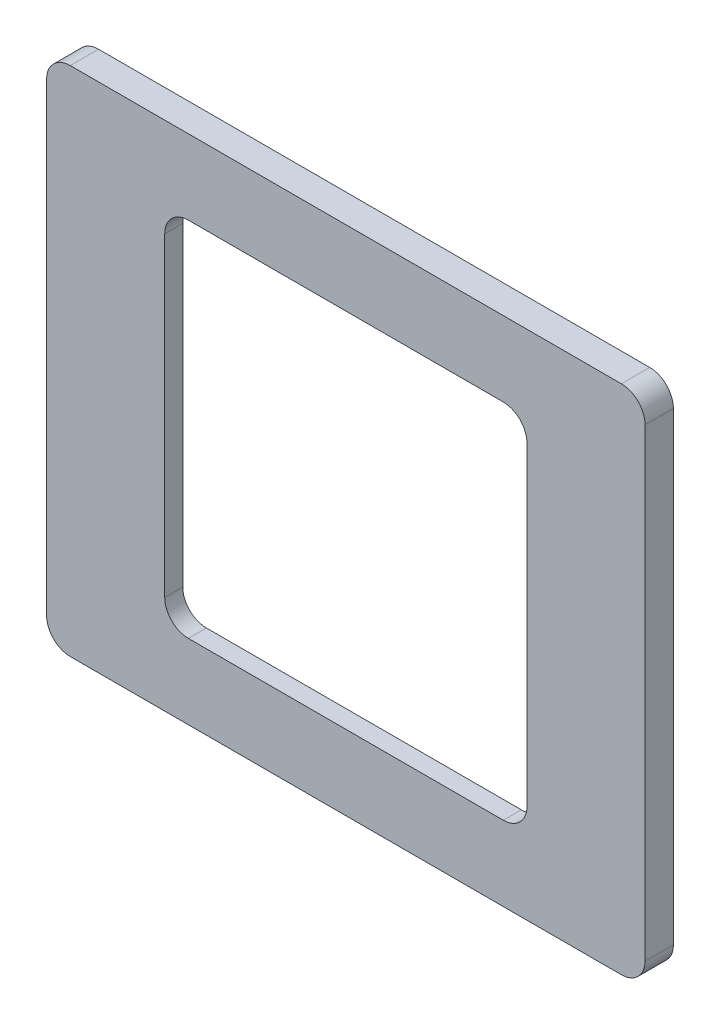
ISO-10303-21;
HEADER;
FILE_DESCRIPTION(('STEP AP214'),'2;1');
FILE_NAME('part.step','',(''),(''),'','','');
FILE_SCHEMA(('AUTOMOTIVE_DESIGN { 1 0 10303 214 1 1 1 1 }'));
ENDSEC;
DATA;
#1=APPLICATION_CONTEXT('core data for automotive mechanical design processes');
#2=APPLICATION_PROTOCOL_DEFINITION('international standard','automotive_design',2000,#1);
#3=PRODUCT_CONTEXT('',#1,'mechanical');
#4=PRODUCT('Part','Part','',(#3));
#5=PRODUCT_RELATED_PRODUCT_CATEGORY('part','',(#4));
#6=PRODUCT_DEFINITION_FORMATION('','',#4);
#7=PRODUCT_DEFINITION_CONTEXT('part definition',#1,'design');
#8=PRODUCT_DEFINITION('design','',#6,#7);
#9=PRODUCT_DEFINITION_SHAPE('','',#8);
#10=(LENGTH_UNIT() NAMED_UNIT(*) SI_UNIT(.MILLI.,.METRE.));
#11=(NAMED_UNIT(*) PLANE_ANGLE_UNIT() SI_UNIT($,.RADIAN.));
#12=(NAMED_UNIT(*) SI_UNIT($,.STERADIAN.) SOLID_ANGLE_UNIT());
#13=UNCERTAINTY_MEASURE_WITH_UNIT(LENGTH_MEASURE(1.E-05),#10,'distance_accuracy_value','');
#14=(GEOMETRIC_REPRESENTATION_CONTEXT(3) GLOBAL_UNCERTAINTY_ASSIGNED_CONTEXT((#13)) GLOBAL_UNIT_ASSIGNED_CONTEXT((#10,
#11,#12)) REPRESENTATION_CONTEXT('',''));
#15=CARTESIAN_POINT('',(0.,0.,0.));
#16=DIRECTION('',(0.,0.,1.));
#17=DIRECTION('',(1.,0.,0.));
#18=AXIS2_PLACEMENT_3D('',#15,#16,#17);
#19=CARTESIAN_POINT('',(38.,65.,-3.59999999999999));
#20=DIRECTION('',(-1.,0.,0.));
#21=DIRECTION('',(0.,0.,1.));
#22=AXIS2_PLACEMENT_3D('',#19,#20,#21);
#23=PLANE('',#22);
#24=DIRECTION('',(0.,-1.,0.));
#25=VECTOR('',#24,1.);
#26=CARTESIAN_POINT('',(38.,65.,0.));
#27=LINE('',#26,#25);
#28=CARTESIAN_POINT('',(38.,62.,0.));
#29=VERTEX_POINT('',#28);
#30=CARTESIAN_POINT('',(38.,3.,0.));
#31=VERTEX_POINT('',#30);
#32=EDGE_CURVE('E460',#29,#31,#27,.T.);
#33=ORIENTED_EDGE('',*,*,#32,.T.);
#34=DIRECTION('',(0.,0.,-1.));
#35=VECTOR('',#34,1.);
#36=CARTESIAN_POINT('',(38.,3.,-3.59999999999999));
#37=LINE('',#36,#35);
#38=CARTESIAN_POINT('',(38.,3.,-3.59999999999999));
#39=VERTEX_POINT('',#38);
#40=EDGE_CURVE('E257',#31,#39,#37,.T.);
#41=ORIENTED_EDGE('',*,*,#40,.T.);
#42=DIRECTION('',(0.,-1.,0.));
#43=VECTOR('',#42,1.);
#44=CARTESIAN_POINT('',(38.,65.,-3.59999999999999));
#45=LINE('',#44,#43);
#46=CARTESIAN_POINT('',(38.,62.,-3.59999999999999));
#47=VERTEX_POINT('',#46);
#48=EDGE_CURVE('E249',#47,#39,#45,.T.);
#49=ORIENTED_EDGE('',*,*,#48,.F.);
#50=DIRECTION('',(0.,0.,-1.));
#51=VECTOR('',#50,1.);
#52=CARTESIAN_POINT('',(38.,62.,0.));
#53=LINE('',#52,#51);
#54=EDGE_CURVE('E262',#47,#29,#53,.F.);
#55=ORIENTED_EDGE('',*,*,#54,.T.);
#56=EDGE_LOOP('',(#33,#41,#49,#55));
#57=FACE_BOUND('',#56,.T.);
#58=ADVANCED_FACE('F38',(#57),#23,.F.);
#59=CARTESIAN_POINT('',(38.,65.,-3.59999999999999));
#60=DIRECTION('',(0.,0.,1.));
#61=DIRECTION('',(1.,0.,0.));
#62=AXIS2_PLACEMENT_3D('',#59,#60,#61);
#63=PLANE('',#62);
#64=DIRECTION('',(-1.,0.,0.));
#65=VECTOR('',#64,1.);
#66=CARTESIAN_POINT('',(-25.8,6.70000000000001,-3.59999999999999));
#67=LINE('',#66,#65);
#68=CARTESIAN_POINT('',(23.5639320225002,6.70000000000001,-3.59999999999999));
#69=VERTEX_POINT('',#68);
#70=CARTESIAN_POINT('',(-23.5639320225002,6.70000000000001,-3.59999999999999));
#71=VERTEX_POINT('',#70);
#72=EDGE_CURVE('E449',#69,#71,#67,.T.);
#73=ORIENTED_EDGE('',*,*,#72,.F.);
#74=CARTESIAN_POINT('',(23.5639320225002,4.70000000000001,-3.59999999999999));
#75=DIRECTION('',(0.,0.,1.));
#76=DIRECTION('',(1.,0.,0.));
#77=AXIS2_PLACEMENT_3D('',#74,#75,#76);
#78=CIRCLE('',#77,2.);
#79=CARTESIAN_POINT('',(25.0546440075001,6.03333333333334,-3.59999999999999));
#80=VERTEX_POINT('',#79);
#81=EDGE_CURVE('E356',#69,#80,#78,.F.);
#82=ORIENTED_EDGE('',*,*,#81,.T.);
#83=CARTESIAN_POINT('',(25.8,6.70000000000001,-3.59999999999999));
#84=DIRECTION('',(0.,0.,-1.));
#85=DIRECTION('',(-1.,0.,0.));
#86=AXIS2_PLACEMENT_3D('',#83,#84,#85);
#87=CIRCLE('',#86,1.);
#88=CARTESIAN_POINT('',(26.4666666666667,7.44535599249994,-3.59999999999999));
#89=VERTEX_POINT('',#88);
#90=EDGE_CURVE('E436',#89,#80,#87,.T.);
#91=ORIENTED_EDGE('',*,*,#90,.F.);
#92=CARTESIAN_POINT('',(27.8,8.9360679774998,-3.59999999999999));
#93=DIRECTION('',(0.,0.,1.));
#94=DIRECTION('',(1.,0.,0.));
#95=AXIS2_PLACEMENT_3D('',#92,#93,#94);
#96=CIRCLE('',#95,2.);
#97=CARTESIAN_POINT('',(25.8,8.9360679774998,-3.59999999999999));
#98=VERTEX_POINT('',#97);
#99=EDGE_CURVE('E354',#89,#98,#96,.F.);
#100=ORIENTED_EDGE('',*,*,#99,.T.);
#101=DIRECTION('',(0.,-1.,0.));
#102=VECTOR('',#101,1.);
#103=CARTESIAN_POINT('',(25.8,6.70000000000001,-3.59999999999999));
#104=LINE('',#103,#102);
#105=CARTESIAN_POINT('',(25.8,56.0639320225002,-3.59999999999999));
#106=VERTEX_POINT('',#105);
#107=EDGE_CURVE('E430',#106,#98,#104,.T.);
#108=ORIENTED_EDGE('',*,*,#107,.F.);
#109=CARTESIAN_POINT('',(27.8,56.0639320225002,-3.59999999999999));
#110=DIRECTION('',(0.,0.,1.));
#111=DIRECTION('',(1.,0.,0.));
#112=AXIS2_PLACEMENT_3D('',#109,#110,#111);
#113=CIRCLE('',#112,2.);
#114=CARTESIAN_POINT('',(26.4666666666667,57.5546440075001,-3.59999999999999));
#115=VERTEX_POINT('',#114);
#116=EDGE_CURVE('E352',#106,#115,#113,.F.);
#117=ORIENTED_EDGE('',*,*,#116,.T.);
#118=CARTESIAN_POINT('',(25.8,58.3,-3.59999999999999));
#119=DIRECTION('',(0.,0.,-1.));
#120=DIRECTION('',(-1.,0.,0.));
#121=AXIS2_PLACEMENT_3D('',#118,#119,#120);
#122=CIRCLE('',#121,1.);
#123=CARTESIAN_POINT('',(25.0546440075001,58.9666666666667,-3.59999999999999));
#124=VERTEX_POINT('',#123);
#125=EDGE_CURVE('E892',#124,#115,#122,.T.);
#126=ORIENTED_EDGE('',*,*,#125,.F.);
#127=CARTESIAN_POINT('',(23.5639320225002,60.3,-3.59999999999999));
#128=DIRECTION('',(0.,0.,1.));
#129=DIRECTION('',(1.,0.,0.));
#130=AXIS2_PLACEMENT_3D('',#127,#128,#129);
#131=CIRCLE('',#130,2.);
#132=CARTESIAN_POINT('',(23.5639320225002,58.3,-3.59999999999999));
#133=VERTEX_POINT('',#132);
#134=EDGE_CURVE('E350',#124,#133,#131,.F.);
#135=ORIENTED_EDGE('',*,*,#134,.T.);
#136=DIRECTION('',(1.,0.,0.));
#137=VECTOR('',#136,1.);
#138=CARTESIAN_POINT('',(-25.8,58.3,-3.59999999999999));
#139=LINE('',#138,#137);
#140=CARTESIAN_POINT('',(-23.5639320225002,58.3,-3.59999999999999));
#141=VERTEX_POINT('',#140);
#142=EDGE_CURVE('E442',#141,#133,#139,.T.);
#143=ORIENTED_EDGE('',*,*,#142,.F.);
#144=CARTESIAN_POINT('',(-23.5639320225002,60.3,-3.59999999999999));
#145=DIRECTION('',(0.,0.,1.));
#146=DIRECTION('',(1.,0.,0.));
#147=AXIS2_PLACEMENT_3D('',#144,#145,#146);
#148=CIRCLE('',#147,2.);
#149=CARTESIAN_POINT('',(-25.0546440075001,58.9666666666667,-3.59999999999999));
#150=VERTEX_POINT('',#149);
#151=EDGE_CURVE('E348',#141,#150,#148,.F.);
#152=ORIENTED_EDGE('',*,*,#151,.T.);
#153=CARTESIAN_POINT('',(-25.8,58.3,-3.59999999999999));
#154=DIRECTION('',(0.,0.,-1.));
#155=DIRECTION('',(-1.,0.,0.));
#156=AXIS2_PLACEMENT_3D('',#153,#154,#155);
#157=CIRCLE('',#156,1.);
#158=CARTESIAN_POINT('',(-26.4666666666667,57.5546440075001,-3.59999999999999));
#159=VERTEX_POINT('',#158);
#160=EDGE_CURVE('E428',#159,#150,#157,.T.);
#161=ORIENTED_EDGE('',*,*,#160,.F.);
#162=CARTESIAN_POINT('',(-27.8,56.0639320225002,-3.59999999999999));
#163=DIRECTION('',(0.,0.,1.));
#164=DIRECTION('',(1.,0.,0.));
#165=AXIS2_PLACEMENT_3D('',#162,#163,#164);
#166=CIRCLE('',#165,2.);
#167=CARTESIAN_POINT('',(-25.8,56.0639320225002,-3.59999999999999));
#168=VERTEX_POINT('',#167);
#169=EDGE_CURVE('E346',#159,#168,#166,.F.);
#170=ORIENTED_EDGE('',*,*,#169,.T.);
#171=DIRECTION('',(0.,1.,0.));
#172=VECTOR('',#171,1.);
#173=CARTESIAN_POINT('',(-25.8,6.70000000000001,-3.59999999999999));
#174=LINE('',#173,#172);
#175=CARTESIAN_POINT('',(-25.8,8.93606797749981,-3.59999999999999));
#176=VERTEX_POINT('',#175);
#177=EDGE_CURVE('E425',#176,#168,#174,.T.);
#178=ORIENTED_EDGE('',*,*,#177,.F.);
#179=CARTESIAN_POINT('',(-27.8,8.93606797749981,-3.59999999999999));
#180=DIRECTION('',(0.,0.,1.));
#181=DIRECTION('',(1.,0.,0.));
#182=AXIS2_PLACEMENT_3D('',#179,#180,#181);
#183=CIRCLE('',#182,2.);
#184=CARTESIAN_POINT('',(-26.4666666666667,7.44535599249994,-3.59999999999999));
#185=VERTEX_POINT('',#184);
#186=EDGE_CURVE('E344',#176,#185,#183,.F.);
#187=ORIENTED_EDGE('',*,*,#186,.T.);
#188=CARTESIAN_POINT('',(-25.8,6.70000000000001,-3.59999999999999));
#189=DIRECTION('',(0.,0.,-1.));
#190=DIRECTION('',(-1.,0.,0.));
#191=AXIS2_PLACEMENT_3D('',#188,#189,#190);
#192=CIRCLE('',#191,1.);
#193=CARTESIAN_POINT('',(-25.0546440075001,6.03333333333335,-3.59999999999999));
#194=VERTEX_POINT('',#193);
#195=EDGE_CURVE('E423',#194,#185,#192,.T.);
#196=ORIENTED_EDGE('',*,*,#195,.F.);
#197=CARTESIAN_POINT('',(-23.5639320225002,4.70000000000001,-3.59999999999999));
#198=DIRECTION('',(0.,0.,1.));
#199=DIRECTION('',(1.,0.,0.));
#200=AXIS2_PLACEMENT_3D('',#197,#198,#199);
#201=CIRCLE('',#200,2.);
#202=EDGE_CURVE('E342',#194,#71,#201,.F.);
#203=ORIENTED_EDGE('',*,*,#202,.T.);
#204=EDGE_LOOP('',(#73,#82,#91,#100,#108,#117,#126,#135,#143,#152,#161,#170,#178,#187,#196,#203));
#205=FACE_BOUND('',#204,.T.);
#206=ORIENTED_EDGE('',*,*,#48,.T.);
#207=CARTESIAN_POINT('',(35.,3.,-3.59999999999999));
#208=DIRECTION('',(0.,0.,1.));
#209=DIRECTION('',(1.,0.,0.));
#210=AXIS2_PLACEMENT_3D('',#207,#208,#209);
#211=CIRCLE('',#210,3.);
#212=CARTESIAN_POINT('',(35.,0.,-3.59999999999999));
#213=VERTEX_POINT('',#212);
#214=EDGE_CURVE('E277',#39,#213,#211,.F.);
#215=ORIENTED_EDGE('',*,*,#214,.T.);
#216=DIRECTION('',(-1.,0.,0.));
#217=VECTOR('',#216,1.);
#218=CARTESIAN_POINT('',(38.,0.,-3.59999999999999));
#219=LINE('',#218,#217);
#220=CARTESIAN_POINT('',(-35.,0.,-3.59999999999999));
#221=VERTEX_POINT('',#220);
#222=EDGE_CURVE('E446',#213,#221,#219,.T.);
#223=ORIENTED_EDGE('',*,*,#222,.T.);
#224=CARTESIAN_POINT('',(-35.,3.,-3.59999999999999));
#225=DIRECTION('',(0.,0.,1.));
#226=DIRECTION('',(1.,0.,0.));
#227=AXIS2_PLACEMENT_3D('',#224,#225,#226);
#228=CIRCLE('',#227,3.);
#229=CARTESIAN_POINT('',(-38.,3.,-3.59999999999999));
#230=VERTEX_POINT('',#229);
#231=EDGE_CURVE('E275',#221,#230,#228,.F.);
#232=ORIENTED_EDGE('',*,*,#231,.T.);
#233=DIRECTION('',(0.,-1.,0.));
#234=VECTOR('',#233,1.);
#235=CARTESIAN_POINT('',(-38.,65.,-3.59999999999999));
#236=LINE('',#235,#234);
#237=CARTESIAN_POINT('',(-38.,62.,-3.59999999999999));
#238=VERTEX_POINT('',#237);
#239=EDGE_CURVE('E265',#238,#230,#236,.T.);
#240=ORIENTED_EDGE('',*,*,#239,.F.);
#241=CARTESIAN_POINT('',(-35.,62.,-3.59999999999999));
#242=DIRECTION('',(0.,0.,1.));
#243=DIRECTION('',(1.,0.,0.));
#244=AXIS2_PLACEMENT_3D('',#241,#242,#243);
#245=CIRCLE('',#244,3.);
#246=CARTESIAN_POINT('',(-35.,65.,-3.59999999999999));
#247=VERTEX_POINT('',#246);
#248=EDGE_CURVE('E256',#238,#247,#245,.F.);
#249=ORIENTED_EDGE('',*,*,#248,.T.);
#250=DIRECTION('',(-1.,0.,0.));
#251=VECTOR('',#250,1.);
#252=CARTESIAN_POINT('',(38.,65.,-3.59999999999999));
#253=LINE('',#252,#251);
#254=CARTESIAN_POINT('',(35.,65.,-3.59999999999999));
#255=VERTEX_POINT('',#254);
#256=EDGE_CURVE('E251',#255,#247,#253,.T.);
#257=ORIENTED_EDGE('',*,*,#256,.F.);
#258=CARTESIAN_POINT('',(35.,62.,-3.59999999999999));
#259=DIRECTION('',(0.,0.,1.));
#260=DIRECTION('',(1.,0.,0.));
#261=AXIS2_PLACEMENT_3D('',#258,#259,#260);
#262=CIRCLE('',#261,3.);
#263=EDGE_CURVE('E246',#255,#47,#262,.F.);
#264=ORIENTED_EDGE('',*,*,#263,.T.);
#265=EDGE_LOOP('',(#206,#215,#223,#232,#240,#249,#257,#264));
#266=FACE_BOUND('',#265,.T.);
#267=ADVANCED_FACE('F248',(#205,#266),#63,.F.);
#268=CARTESIAN_POINT('',(-38.,65.,-3.59999999999999));
#269=DIRECTION('',(1.,0.,0.));
#270=DIRECTION('',(0.,0.,-1.));
#271=AXIS2_PLACEMENT_3D('',#268,#269,#270);
#272=PLANE('',#271);
#273=ORIENTED_EDGE('',*,*,#239,.T.);
#274=DIRECTION('',(0.,0.,1.));
#275=VECTOR('',#274,1.);
#276=CARTESIAN_POINT('',(-38.,3.,-3.59999999999999));
#277=LINE('',#276,#275);
#278=CARTESIAN_POINT('',(-38.,3.,0.));
#279=VERTEX_POINT('',#278);
#280=EDGE_CURVE('E292',#230,#279,#277,.T.);
#281=ORIENTED_EDGE('',*,*,#280,.T.);
#282=DIRECTION('',(0.,-1.,0.));
#283=VECTOR('',#282,1.);
#284=CARTESIAN_POINT('',(-38.,65.,0.));
#285=LINE('',#284,#283);
#286=CARTESIAN_POINT('',(-38.,62.,0.));
#287=VERTEX_POINT('',#286);
#288=EDGE_CURVE('E466',#287,#279,#285,.T.);
#289=ORIENTED_EDGE('',*,*,#288,.F.);
#290=DIRECTION('',(0.,0.,1.));
#291=VECTOR('',#290,1.);
#292=CARTESIAN_POINT('',(-38.,62.,-3.59999999999999));
#293=LINE('',#292,#291);
#294=EDGE_CURVE('E290',#287,#238,#293,.F.);
#295=ORIENTED_EDGE('',*,*,#294,.T.);
#296=EDGE_LOOP('',(#273,#281,#289,#295));
#297=FACE_BOUND('',#296,.T.);
#298=ADVANCED_FACE('F472',(#297),#272,.F.);
#299=CARTESIAN_POINT('',(-38.,65.,0.));
#300=DIRECTION('',(0.,0.,-1.));
#301=DIRECTION('',(-1.,0.,0.));
#302=AXIS2_PLACEMENT_3D('',#299,#300,#301);
#303=PLANE('',#302);
#304=DIRECTION('',(0.,1.,0.));
#305=VECTOR('',#304,1.);
#306=CARTESIAN_POINT('',(-23.,9.50000000000002,0.));
#307=LINE('',#306,#305);
#308=CARTESIAN_POINT('',(-23.,12.5,0.));
#309=VERTEX_POINT('',#308);
#310=CARTESIAN_POINT('',(-23.,52.5,0.));
#311=VERTEX_POINT('',#310);
#312=EDGE_CURVE('E915',#309,#311,#307,.T.);
#313=ORIENTED_EDGE('',*,*,#312,.T.);
#314=CARTESIAN_POINT('',(-20.,52.5,0.));
#315=DIRECTION('',(0.,0.,-1.));
#316=DIRECTION('',(-1.,0.,0.));
#317=AXIS2_PLACEMENT_3D('',#314,#315,#316);
#318=CIRCLE('',#317,3.);
#319=CARTESIAN_POINT('',(-20.,55.5,0.));
#320=VERTEX_POINT('',#319);
#321=EDGE_CURVE('E322',#311,#320,#318,.T.);
#322=ORIENTED_EDGE('',*,*,#321,.T.);
#323=DIRECTION('',(1.,0.,0.));
#324=VECTOR('',#323,1.);
#325=CARTESIAN_POINT('',(-23.,55.5,0.));
#326=LINE('',#325,#324);
#327=CARTESIAN_POINT('',(20.,55.5,0.));
#328=VERTEX_POINT('',#327);
#329=EDGE_CURVE('E899',#320,#328,#326,.T.);
#330=ORIENTED_EDGE('',*,*,#329,.T.);
#331=CARTESIAN_POINT('',(20.,52.5,0.));
#332=DIRECTION('',(0.,0.,-1.));
#333=DIRECTION('',(-1.,0.,0.));
#334=AXIS2_PLACEMENT_3D('',#331,#332,#333);
#335=CIRCLE('',#334,3.);
#336=CARTESIAN_POINT('',(23.,52.5,0.));
#337=VERTEX_POINT('',#336);
#338=EDGE_CURVE('E326',#328,#337,#335,.T.);
#339=ORIENTED_EDGE('',*,*,#338,.T.);
#340=DIRECTION('',(0.,-1.,0.));
#341=VECTOR('',#340,1.);
#342=CARTESIAN_POINT('',(23.,9.50000000000001,0.));
#343=LINE('',#342,#341);
#344=CARTESIAN_POINT('',(23.,12.5,0.));
#345=VERTEX_POINT('',#344);
#346=EDGE_CURVE('E903',#337,#345,#343,.T.);
#347=ORIENTED_EDGE('',*,*,#346,.T.);
#348=CARTESIAN_POINT('',(20.,12.5,0.));
#349=DIRECTION('',(0.,0.,-1.));
#350=DIRECTION('',(-1.,0.,0.));
#351=AXIS2_PLACEMENT_3D('',#348,#349,#350);
#352=CIRCLE('',#351,3.);
#353=CARTESIAN_POINT('',(20.,9.50000000000001,0.));
#354=VERTEX_POINT('',#353);
#355=EDGE_CURVE('E330',#345,#354,#352,.T.);
#356=ORIENTED_EDGE('',*,*,#355,.T.);
#357=DIRECTION('',(-1.,0.,0.));
#358=VECTOR('',#357,1.);
#359=CARTESIAN_POINT('',(-23.,9.50000000000002,0.));
#360=LINE('',#359,#358);
#361=CARTESIAN_POINT('',(-20.,9.50000000000002,0.));
#362=VERTEX_POINT('',#361);
#363=EDGE_CURVE('E918',#354,#362,#360,.T.);
#364=ORIENTED_EDGE('',*,*,#363,.T.);
#365=CARTESIAN_POINT('',(-20.,12.5,0.));
#366=DIRECTION('',(0.,0.,-1.));
#367=DIRECTION('',(-1.,0.,0.));
#368=AXIS2_PLACEMENT_3D('',#365,#366,#367);
#369=CIRCLE('',#368,3.);
#370=EDGE_CURVE('E334',#362,#309,#369,.T.);
#371=ORIENTED_EDGE('',*,*,#370,.T.);
#372=EDGE_LOOP('',(#313,#322,#330,#339,#347,#356,#364,#371));
#373=FACE_BOUND('',#372,.T.);
#374=DIRECTION('',(1.,0.,0.));
#375=VECTOR('',#374,1.);
#376=CARTESIAN_POINT('',(-38.,0.,0.));
#377=LINE('',#376,#375);
#378=CARTESIAN_POINT('',(-35.,0.,0.));
#379=VERTEX_POINT('',#378);
#380=CARTESIAN_POINT('',(35.,0.,0.));
#381=VERTEX_POINT('',#380);
#382=EDGE_CURVE('E457',#379,#381,#377,.T.);
#383=ORIENTED_EDGE('',*,*,#382,.T.);
#384=CARTESIAN_POINT('',(35.,3.,0.));
#385=DIRECTION('',(0.,0.,-1.));
#386=DIRECTION('',(-1.,0.,0.));
#387=AXIS2_PLACEMENT_3D('',#384,#385,#386);
#388=CIRCLE('',#387,3.);
#389=EDGE_CURVE('E288',#381,#31,#388,.F.);
#390=ORIENTED_EDGE('',*,*,#389,.T.);
#391=ORIENTED_EDGE('',*,*,#32,.F.);
#392=CARTESIAN_POINT('',(35.,62.,0.));
#393=DIRECTION('',(0.,0.,-1.));
#394=DIRECTION('',(-1.,0.,0.));
#395=AXIS2_PLACEMENT_3D('',#392,#393,#394);
#396=CIRCLE('',#395,3.);
#397=CARTESIAN_POINT('',(35.,65.,0.));
#398=VERTEX_POINT('',#397);
#399=EDGE_CURVE('E269',#29,#398,#396,.F.);
#400=ORIENTED_EDGE('',*,*,#399,.T.);
#401=DIRECTION('',(1.,0.,0.));
#402=VECTOR('',#401,1.);
#403=CARTESIAN_POINT('',(-38.,65.,0.));
#404=LINE('',#403,#402);
#405=CARTESIAN_POINT('',(-35.,65.,0.));
#406=VERTEX_POINT('',#405);
#407=EDGE_CURVE('E456',#406,#398,#404,.T.);
#408=ORIENTED_EDGE('',*,*,#407,.F.);
#409=CARTESIAN_POINT('',(-35.,62.,0.));
#410=DIRECTION('',(0.,0.,-1.));
#411=DIRECTION('',(-1.,0.,0.));
#412=AXIS2_PLACEMENT_3D('',#409,#410,#411);
#413=CIRCLE('',#412,3.);
#414=EDGE_CURVE('E284',#406,#287,#413,.F.);
#415=ORIENTED_EDGE('',*,*,#414,.T.);
#416=ORIENTED_EDGE('',*,*,#288,.T.);
#417=CARTESIAN_POINT('',(-35.,3.,0.));
#418=DIRECTION('',(0.,0.,-1.));
#419=DIRECTION('',(-1.,0.,0.));
#420=AXIS2_PLACEMENT_3D('',#417,#418,#419);
#421=CIRCLE('',#420,3.);
#422=EDGE_CURVE('E286',#279,#379,#421,.F.);
#423=ORIENTED_EDGE('',*,*,#422,.T.);
#424=EDGE_LOOP('',(#383,#390,#391,#400,#408,#415,#416,#423));
#425=FACE_BOUND('',#424,.T.);
#426=ADVANCED_FACE('F482',(#373,#425),#303,.F.);
#427=CARTESIAN_POINT('',(0.,65.,0.));
#428=DIRECTION('',(0.,1.,0.));
#429=DIRECTION('',(0.,0.,1.));
#430=AXIS2_PLACEMENT_3D('',#427,#428,#429);
#431=PLANE('',#430);
#432=ORIENTED_EDGE('',*,*,#256,.T.);
#433=DIRECTION('',(0.,0.,1.));
#434=VECTOR('',#433,1.);
#435=CARTESIAN_POINT('',(-35.,65.,0.));
#436=LINE('',#435,#434);
#437=EDGE_CURVE('E297',#247,#406,#436,.T.);
#438=ORIENTED_EDGE('',*,*,#437,.T.);
#439=ORIENTED_EDGE('',*,*,#407,.T.);
#440=DIRECTION('',(0.,0.,-1.));
#441=VECTOR('',#440,1.);
#442=CARTESIAN_POINT('',(35.,65.,-3.59999999999999));
#443=LINE('',#442,#441);
#444=EDGE_CURVE('E295',#398,#255,#443,.T.);
#445=ORIENTED_EDGE('',*,*,#444,.T.);
#446=EDGE_LOOP('',(#432,#438,#439,#445));
#447=FACE_BOUND('',#446,.T.);
#448=ADVANCED_FACE('F492',(#447),#431,.T.);
#449=CARTESIAN_POINT('',(0.,0.,0.));
#450=DIRECTION('',(0.,1.,0.));
#451=DIRECTION('',(0.,0.,1.));
#452=AXIS2_PLACEMENT_3D('',#449,#450,#451);
#453=PLANE('',#452);
#454=ORIENTED_EDGE('',*,*,#222,.F.);
#455=DIRECTION('',(0.,0.,-1.));
#456=VECTOR('',#455,1.);
#457=CARTESIAN_POINT('',(35.,0.,0.));
#458=LINE('',#457,#456);
#459=EDGE_CURVE('E281',#213,#381,#458,.F.);
#460=ORIENTED_EDGE('',*,*,#459,.T.);
#461=ORIENTED_EDGE('',*,*,#382,.F.);
#462=DIRECTION('',(0.,0.,1.));
#463=VECTOR('',#462,1.);
#464=CARTESIAN_POINT('',(-35.,0.,0.));
#465=LINE('',#464,#463);
#466=EDGE_CURVE('E279',#379,#221,#465,.F.);
#467=ORIENTED_EDGE('',*,*,#466,.T.);
#468=EDGE_LOOP('',(#454,#460,#461,#467));
#469=FACE_BOUND('',#468,.T.);
#470=ADVANCED_FACE('F486',(#469),#453,.F.);
#471=CARTESIAN_POINT('',(25.8,6.70000000000001,-2.28999999999999));
#472=DIRECTION('',(1.,0.,0.));
#473=DIRECTION('',(0.,1.,0.));
#474=AXIS2_PLACEMENT_3D('',#471,#472,#473);
#475=PLANE('',#474);
#476=ORIENTED_EDGE('',*,*,#107,.T.);
#477=DIRECTION('',(0.,0.,-1.));
#478=VECTOR('',#477,1.);
#479=CARTESIAN_POINT('',(25.8,8.9360679774998,-2.28999999999999));
#480=LINE('',#479,#478);
#481=CARTESIAN_POINT('',(25.8,8.9360679774998,-2.28999999999999));
#482=VERTEX_POINT('',#481);
#483=EDGE_CURVE('E365',#98,#482,#480,.F.);
#484=ORIENTED_EDGE('',*,*,#483,.T.);
#485=DIRECTION('',(0.,-1.,0.));
#486=VECTOR('',#485,1.);
#487=CARTESIAN_POINT('',(25.8,6.70000000000001,-2.28999999999999));
#488=LINE('',#487,#486);
#489=CARTESIAN_POINT('',(25.8,56.0639320225002,-2.28999999999999));
#490=VERTEX_POINT('',#489);
#491=EDGE_CURVE('E439',#490,#482,#488,.T.);
#492=ORIENTED_EDGE('',*,*,#491,.F.);
#493=DIRECTION('',(0.,0.,-1.));
#494=VECTOR('',#493,1.);
#495=CARTESIAN_POINT('',(25.8,56.0639320225002,-2.28999999999999));
#496=LINE('',#495,#494);
#497=EDGE_CURVE('E362',#490,#106,#496,.T.);
#498=ORIENTED_EDGE('',*,*,#497,.T.);
#499=EDGE_LOOP('',(#476,#484,#492,#498));
#500=FACE_BOUND('',#499,.T.);
#501=ADVANCED_FACE('F555',(#500),#475,.F.);
#502=CARTESIAN_POINT('',(-25.8,58.3,-2.28999999999999));
#503=DIRECTION('',(0.,1.,0.));
#504=DIRECTION('',(0.,0.,1.));
#505=AXIS2_PLACEMENT_3D('',#502,#503,#504);
#506=PLANE('',#505);
#507=ORIENTED_EDGE('',*,*,#142,.T.);
#508=DIRECTION('',(0.,0.,-1.));
#509=VECTOR('',#508,1.);
#510=CARTESIAN_POINT('',(23.5639320225002,58.3,-2.28999999999999));
#511=LINE('',#510,#509);
#512=CARTESIAN_POINT('',(23.5639320225002,58.3,-2.28999999999999));
#513=VERTEX_POINT('',#512);
#514=EDGE_CURVE('E375',#133,#513,#511,.F.);
#515=ORIENTED_EDGE('',*,*,#514,.T.);
#516=DIRECTION('',(1.,0.,0.));
#517=VECTOR('',#516,1.);
#518=CARTESIAN_POINT('',(-25.8,58.3,-2.28999999999999));
#519=LINE('',#518,#517);
#520=CARTESIAN_POINT('',(-23.5639320225002,58.3,-2.28999999999999));
#521=VERTEX_POINT('',#520);
#522=EDGE_CURVE('E416',#521,#513,#519,.T.);
#523=ORIENTED_EDGE('',*,*,#522,.F.);
#524=DIRECTION('',(0.,0.,-1.));
#525=VECTOR('',#524,1.);
#526=CARTESIAN_POINT('',(-23.5639320225002,58.3,-2.28999999999999));
#527=LINE('',#526,#525);
#528=EDGE_CURVE('E372',#521,#141,#527,.T.);
#529=ORIENTED_EDGE('',*,*,#528,.T.);
#530=EDGE_LOOP('',(#507,#515,#523,#529));
#531=FACE_BOUND('',#530,.T.);
#532=ADVANCED_FACE('F552',(#531),#506,.F.);
#533=CARTESIAN_POINT('',(-25.8,6.70000000000001,-2.28999999999999));
#534=DIRECTION('',(-1.,0.,0.));
#535=DIRECTION('',(0.,0.,1.));
#536=AXIS2_PLACEMENT_3D('',#533,#534,#535);
#537=PLANE('',#536);
#538=ORIENTED_EDGE('',*,*,#177,.T.);
#539=DIRECTION('',(0.,0.,-1.));
#540=VECTOR('',#539,1.);
#541=CARTESIAN_POINT('',(-25.8,56.0639320225002,-2.28999999999999));
#542=LINE('',#541,#540);
#543=CARTESIAN_POINT('',(-25.8,56.0639320225002,-2.28999999999999));
#544=VERTEX_POINT('',#543);
#545=EDGE_CURVE('E385',#168,#544,#542,.F.);
#546=ORIENTED_EDGE('',*,*,#545,.T.);
#547=DIRECTION('',(0.,1.,0.));
#548=VECTOR('',#547,1.);
#549=CARTESIAN_POINT('',(-25.8,6.70000000000001,-2.28999999999999));
#550=LINE('',#549,#548);
#551=CARTESIAN_POINT('',(-25.8,8.93606797749981,-2.28999999999999));
#552=VERTEX_POINT('',#551);
#553=EDGE_CURVE('E407',#552,#544,#550,.T.);
#554=ORIENTED_EDGE('',*,*,#553,.F.);
#555=DIRECTION('',(0.,0.,-1.));
#556=VECTOR('',#555,1.);
#557=CARTESIAN_POINT('',(-25.8,8.93606797749981,-2.28999999999999));
#558=LINE('',#557,#556);
#559=EDGE_CURVE('E382',#552,#176,#558,.T.);
#560=ORIENTED_EDGE('',*,*,#559,.T.);
#561=EDGE_LOOP('',(#538,#546,#554,#560));
#562=FACE_BOUND('',#561,.T.);
#563=ADVANCED_FACE('F413',(#562),#537,.F.);
#564=CARTESIAN_POINT('',(-25.8,6.70000000000001,-2.28999999999999));
#565=DIRECTION('',(0.,-1.,0.));
#566=DIRECTION('',(1.,0.,0.));
#567=AXIS2_PLACEMENT_3D('',#564,#565,#566);
#568=PLANE('',#567);
#569=DIRECTION('',(-1.,0.,0.));
#570=VECTOR('',#569,1.);
#571=CARTESIAN_POINT('',(-25.8,6.70000000000001,-2.28999999999999));
#572=LINE('',#571,#570);
#573=CARTESIAN_POINT('',(23.5639320225002,6.70000000000001,-2.28999999999999));
#574=VERTEX_POINT('',#573);
#575=CARTESIAN_POINT('',(-23.5639320225002,6.70000000000001,-2.28999999999999));
#576=VERTEX_POINT('',#575);
#577=EDGE_CURVE('E417',#574,#576,#572,.T.);
#578=ORIENTED_EDGE('',*,*,#577,.F.);
#579=DIRECTION('',(0.,0.,-1.));
#580=VECTOR('',#579,1.);
#581=CARTESIAN_POINT('',(23.5639320225002,6.70000000000001,-2.28999999999999));
#582=LINE('',#581,#580);
#583=EDGE_CURVE('E339',#574,#69,#582,.T.);
#584=ORIENTED_EDGE('',*,*,#583,.T.);
#585=ORIENTED_EDGE('',*,*,#72,.T.);
#586=DIRECTION('',(0.,0.,-1.));
#587=VECTOR('',#586,1.);
#588=CARTESIAN_POINT('',(-23.5639320225002,6.70000000000001,-2.28999999999999));
#589=LINE('',#588,#587);
#590=EDGE_CURVE('E336',#71,#576,#589,.F.);
#591=ORIENTED_EDGE('',*,*,#590,.T.);
#592=EDGE_LOOP('',(#578,#584,#585,#591));
#593=FACE_BOUND('',#592,.T.);
#594=ADVANCED_FACE('F550',(#593),#568,.F.);
#595=CARTESIAN_POINT('',(0.,0.,-2.28999999999999));
#596=DIRECTION('',(0.,0.,-1.));
#597=DIRECTION('',(-1.,0.,0.));
#598=AXIS2_PLACEMENT_3D('',#595,#596,#597);
#599=PLANE('',#598);
#600=DIRECTION('',(0.,-1.,0.));
#601=VECTOR('',#600,1.);
#602=CARTESIAN_POINT('',(23.,9.50000000000001,-2.28999999999999));
#603=LINE('',#602,#601);
#604=CARTESIAN_POINT('',(23.,52.5,-2.28999999999999));
#605=VERTEX_POINT('',#604);
#606=CARTESIAN_POINT('',(23.,12.5,-2.28999999999999));
#607=VERTEX_POINT('',#606);
#608=EDGE_CURVE('E910',#605,#607,#603,.T.);
#609=ORIENTED_EDGE('',*,*,#608,.F.);
#610=CARTESIAN_POINT('',(20.,52.5,-2.28999999999999));
#611=DIRECTION('',(0.,0.,-1.));
#612=DIRECTION('',(-1.,0.,0.));
#613=AXIS2_PLACEMENT_3D('',#610,#611,#612);
#614=CIRCLE('',#613,3.);
#615=CARTESIAN_POINT('',(20.,55.5,-2.28999999999999));
#616=VERTEX_POINT('',#615);
#617=EDGE_CURVE('E324',#605,#616,#614,.F.);
#618=ORIENTED_EDGE('',*,*,#617,.T.);
#619=DIRECTION('',(1.,0.,0.));
#620=VECTOR('',#619,1.);
#621=CARTESIAN_POINT('',(-23.,55.5,-2.28999999999999));
#622=LINE('',#621,#620);
#623=CARTESIAN_POINT('',(-20.,55.5,-2.28999999999999));
#624=VERTEX_POINT('',#623);
#625=EDGE_CURVE('E900',#624,#616,#622,.T.);
#626=ORIENTED_EDGE('',*,*,#625,.F.);
#627=CARTESIAN_POINT('',(-20.,52.5,-2.28999999999999));
#628=DIRECTION('',(0.,0.,-1.));
#629=DIRECTION('',(-1.,0.,0.));
#630=AXIS2_PLACEMENT_3D('',#627,#628,#629);
#631=CIRCLE('',#630,3.);
#632=CARTESIAN_POINT('',(-23.,52.5,-2.28999999999999));
#633=VERTEX_POINT('',#632);
#634=EDGE_CURVE('E320',#624,#633,#631,.F.);
#635=ORIENTED_EDGE('',*,*,#634,.T.);
#636=DIRECTION('',(0.,1.,0.));
#637=VECTOR('',#636,1.);
#638=CARTESIAN_POINT('',(-23.,9.50000000000002,-2.28999999999999));
#639=LINE('',#638,#637);
#640=CARTESIAN_POINT('',(-23.,12.5,-2.28999999999999));
#641=VERTEX_POINT('',#640);
#642=EDGE_CURVE('E904',#641,#633,#639,.T.);
#643=ORIENTED_EDGE('',*,*,#642,.F.);
#644=CARTESIAN_POINT('',(-20.,12.5,-2.28999999999999));
#645=DIRECTION('',(0.,0.,-1.));
#646=DIRECTION('',(-1.,0.,0.));
#647=AXIS2_PLACEMENT_3D('',#644,#645,#646);
#648=CIRCLE('',#647,3.);
#649=CARTESIAN_POINT('',(-20.,9.50000000000002,-2.28999999999999));
#650=VERTEX_POINT('',#649);
#651=EDGE_CURVE('E332',#641,#650,#648,.F.);
#652=ORIENTED_EDGE('',*,*,#651,.T.);
#653=DIRECTION('',(-1.,0.,0.));
#654=VECTOR('',#653,1.);
#655=CARTESIAN_POINT('',(-23.,9.50000000000002,-2.28999999999999));
#656=LINE('',#655,#654);
#657=CARTESIAN_POINT('',(20.,9.50000000000001,-2.28999999999999));
#658=VERTEX_POINT('',#657);
#659=EDGE_CURVE('E907',#658,#650,#656,.T.);
#660=ORIENTED_EDGE('',*,*,#659,.F.);
#661=CARTESIAN_POINT('',(20.,12.5,-2.28999999999999));
#662=DIRECTION('',(0.,0.,-1.));
#663=DIRECTION('',(-1.,0.,0.));
#664=AXIS2_PLACEMENT_3D('',#661,#662,#663);
#665=CIRCLE('',#664,3.);
#666=EDGE_CURVE('E328',#658,#607,#665,.F.);
#667=ORIENTED_EDGE('',*,*,#666,.T.);
#668=EDGE_LOOP('',(#609,#618,#626,#635,#643,#652,#660,#667));
#669=FACE_BOUND('',#668,.T.);
#670=CARTESIAN_POINT('',(25.8,58.3,-2.28999999999999));
#671=DIRECTION('',(0.,0.,-1.));
#672=DIRECTION('',(-1.,0.,0.));
#673=AXIS2_PLACEMENT_3D('',#670,#671,#672);
#674=CIRCLE('',#673,1.);
#675=CARTESIAN_POINT('',(26.4666666666667,57.5546440075001,-2.28999999999999));
#676=VERTEX_POINT('',#675);
#677=CARTESIAN_POINT('',(25.0546440075001,58.9666666666667,-2.28999999999999));
#678=VERTEX_POINT('',#677);
#679=EDGE_CURVE('E894',#676,#678,#674,.F.);
#680=ORIENTED_EDGE('',*,*,#679,.F.);
#681=CARTESIAN_POINT('',(27.8,56.0639320225002,-2.28999999999999));
#682=DIRECTION('',(0.,0.,-1.));
#683=DIRECTION('',(-1.,0.,0.));
#684=AXIS2_PLACEMENT_3D('',#681,#682,#683);
#685=CIRCLE('',#684,2.);
#686=EDGE_CURVE('E395',#676,#490,#685,.F.);
#687=ORIENTED_EDGE('',*,*,#686,.T.);
#688=ORIENTED_EDGE('',*,*,#491,.T.);
#689=CARTESIAN_POINT('',(27.8,8.9360679774998,-2.28999999999999));
#690=DIRECTION('',(0.,0.,-1.));
#691=DIRECTION('',(-1.,0.,0.));
#692=AXIS2_PLACEMENT_3D('',#689,#690,#691);
#693=CIRCLE('',#692,2.);
#694=CARTESIAN_POINT('',(26.4666666666667,7.44535599249994,-2.28999999999999));
#695=VERTEX_POINT('',#694);
#696=EDGE_CURVE('E393',#482,#695,#693,.F.);
#697=ORIENTED_EDGE('',*,*,#696,.T.);
#698=CARTESIAN_POINT('',(25.8,6.70000000000001,-2.28999999999999));
#699=DIRECTION('',(0.,0.,-1.));
#700=DIRECTION('',(-1.,0.,0.));
#701=AXIS2_PLACEMENT_3D('',#698,#699,#700);
#702=CIRCLE('',#701,1.);
#703=CARTESIAN_POINT('',(25.0546440075001,6.03333333333334,-2.28999999999999));
#704=VERTEX_POINT('',#703);
#705=EDGE_CURVE('E889',#704,#695,#702,.F.);
#706=ORIENTED_EDGE('',*,*,#705,.F.);
#707=CARTESIAN_POINT('',(23.5639320225002,4.70000000000001,-2.28999999999999));
#708=DIRECTION('',(0.,0.,-1.));
#709=DIRECTION('',(-1.,0.,0.));
#710=AXIS2_PLACEMENT_3D('',#707,#708,#709);
#711=CIRCLE('',#710,2.);
#712=EDGE_CURVE('E391',#704,#574,#711,.F.);
#713=ORIENTED_EDGE('',*,*,#712,.T.);
#714=ORIENTED_EDGE('',*,*,#577,.T.);
#715=CARTESIAN_POINT('',(-23.5639320225002,4.70000000000001,-2.28999999999999));
#716=DIRECTION('',(0.,0.,-1.));
#717=DIRECTION('',(-1.,0.,0.));
#718=AXIS2_PLACEMENT_3D('',#715,#716,#717);
#719=CIRCLE('',#718,2.);
#720=CARTESIAN_POINT('',(-25.0546440075001,6.03333333333335,-2.28999999999999));
#721=VERTEX_POINT('',#720);
#722=EDGE_CURVE('E11',#576,#721,#719,.F.);
#723=ORIENTED_EDGE('',*,*,#722,.T.);
#724=CARTESIAN_POINT('',(-25.8,6.70000000000001,-2.28999999999999));
#725=DIRECTION('',(0.,0.,-1.));
#726=DIRECTION('',(-1.,0.,0.));
#727=AXIS2_PLACEMENT_3D('',#724,#725,#726);
#728=CIRCLE('',#727,1.);
#729=CARTESIAN_POINT('',(-26.4666666666667,7.44535599249994,-2.28999999999999));
#730=VERTEX_POINT('',#729);
#731=EDGE_CURVE('E408',#730,#721,#728,.F.);
#732=ORIENTED_EDGE('',*,*,#731,.F.);
#733=CARTESIAN_POINT('',(-27.8,8.93606797749981,-2.28999999999999));
#734=DIRECTION('',(0.,0.,-1.));
#735=DIRECTION('',(-1.,0.,0.));
#736=AXIS2_PLACEMENT_3D('',#733,#734,#735);
#737=CIRCLE('',#736,2.);
#738=EDGE_CURVE('E46',#730,#552,#737,.F.);
#739=ORIENTED_EDGE('',*,*,#738,.T.);
#740=ORIENTED_EDGE('',*,*,#553,.T.);
#741=CARTESIAN_POINT('',(-27.8,56.0639320225002,-2.28999999999999));
#742=DIRECTION('',(0.,0.,-1.));
#743=DIRECTION('',(-1.,0.,0.));
#744=AXIS2_PLACEMENT_3D('',#741,#742,#743);
#745=CIRCLE('',#744,2.);
#746=CARTESIAN_POINT('',(-26.4666666666667,57.5546440075001,-2.28999999999999));
#747=VERTEX_POINT('',#746);
#748=EDGE_CURVE('E401',#544,#747,#745,.F.);
#749=ORIENTED_EDGE('',*,*,#748,.T.);
#750=CARTESIAN_POINT('',(-25.8,58.3,-2.28999999999999));
#751=DIRECTION('',(0.,0.,-1.));
#752=DIRECTION('',(-1.,0.,0.));
#753=AXIS2_PLACEMENT_3D('',#750,#751,#752);
#754=CIRCLE('',#753,1.);
#755=CARTESIAN_POINT('',(-25.0546440075001,58.9666666666667,-2.28999999999999));
#756=VERTEX_POINT('',#755);
#757=EDGE_CURVE('E433',#756,#747,#754,.F.);
#758=ORIENTED_EDGE('',*,*,#757,.F.);
#759=CARTESIAN_POINT('',(-23.5639320225002,60.3,-2.28999999999999));
#760=DIRECTION('',(0.,0.,-1.));
#761=DIRECTION('',(-1.,0.,0.));
#762=AXIS2_PLACEMENT_3D('',#759,#760,#761);
#763=CIRCLE('',#762,2.);
#764=EDGE_CURVE('E399',#756,#521,#763,.F.);
#765=ORIENTED_EDGE('',*,*,#764,.T.);
#766=ORIENTED_EDGE('',*,*,#522,.T.);
#767=CARTESIAN_POINT('',(23.5639320225002,60.3,-2.28999999999999));
#768=DIRECTION('',(0.,0.,-1.));
#769=DIRECTION('',(-1.,0.,0.));
#770=AXIS2_PLACEMENT_3D('',#767,#768,#769);
#771=CIRCLE('',#770,2.);
#772=EDGE_CURVE('E397',#513,#678,#771,.F.);
#773=ORIENTED_EDGE('',*,*,#772,.T.);
#774=EDGE_LOOP('',(#680,#687,#688,#697,#706,#713,#714,#723,#732,#739,#740,#749,#758,#765,#766,#773));
#775=FACE_BOUND('',#774,.T.);
#776=ADVANCED_FACE('F406',(#669,#775),#599,.T.);
#777=CARTESIAN_POINT('',(-25.8,6.70000000000001,0.538427124746202));
#778=DIRECTION('',(0.,0.,-1.));
#779=DIRECTION('',(-1.,0.,0.));
#780=AXIS2_PLACEMENT_3D('',#777,#778,#779);
#781=CYLINDRICAL_SURFACE('',#780,1.);
#782=ORIENTED_EDGE('',*,*,#195,.T.);
#783=DIRECTION('',(0.,0.,-1.));
#784=VECTOR('',#783,1.);
#785=CARTESIAN_POINT('',(-26.4666666666667,7.44535599249994,0.538427124746202));
#786=LINE('',#785,#784);
#787=EDGE_CURVE('E58',#185,#730,#786,.F.);
#788=ORIENTED_EDGE('',*,*,#787,.T.);
#789=ORIENTED_EDGE('',*,*,#731,.T.);
#790=DIRECTION('',(0.,0.,-1.));
#791=VECTOR('',#790,1.);
#792=CARTESIAN_POINT('',(-25.0546440075001,6.03333333333335,0.538427124746202));
#793=LINE('',#792,#791);
#794=EDGE_CURVE('E388',#721,#194,#793,.T.);
#795=ORIENTED_EDGE('',*,*,#794,.T.);
#796=EDGE_LOOP('',(#782,#788,#789,#795));
#797=FACE_BOUND('',#796,.T.);
#798=ADVANCED_FACE('F426',(#797),#781,.F.);
#799=CARTESIAN_POINT('',(25.8,6.70000000000001,0.538427124746202));
#800=DIRECTION('',(0.,0.,-1.));
#801=DIRECTION('',(-1.,0.,0.));
#802=AXIS2_PLACEMENT_3D('',#799,#800,#801);
#803=CYLINDRICAL_SURFACE('',#802,1.);
#804=ORIENTED_EDGE('',*,*,#90,.T.);
#805=DIRECTION('',(0.,0.,-1.));
#806=VECTOR('',#805,1.);
#807=CARTESIAN_POINT('',(25.0546440075001,6.03333333333334,0.538427124746202));
#808=LINE('',#807,#806);
#809=EDGE_CURVE('E360',#80,#704,#808,.F.);
#810=ORIENTED_EDGE('',*,*,#809,.T.);
#811=ORIENTED_EDGE('',*,*,#705,.T.);
#812=DIRECTION('',(0.,0.,-1.));
#813=VECTOR('',#812,1.);
#814=CARTESIAN_POINT('',(26.4666666666667,7.44535599249994,0.538427124746202));
#815=LINE('',#814,#813);
#816=EDGE_CURVE('E358',#695,#89,#815,.T.);
#817=ORIENTED_EDGE('',*,*,#816,.T.);
#818=EDGE_LOOP('',(#804,#810,#811,#817));
#819=FACE_BOUND('',#818,.T.);
#820=ADVANCED_FACE('F541',(#819),#803,.F.);
#821=CARTESIAN_POINT('',(-25.8,58.3,0.538427124746202));
#822=DIRECTION('',(0.,0.,-1.));
#823=DIRECTION('',(-1.,0.,0.));
#824=AXIS2_PLACEMENT_3D('',#821,#822,#823);
#825=CYLINDRICAL_SURFACE('',#824,1.);
#826=ORIENTED_EDGE('',*,*,#160,.T.);
#827=DIRECTION('',(0.,0.,-1.));
#828=VECTOR('',#827,1.);
#829=CARTESIAN_POINT('',(-25.0546440075001,58.9666666666667,0.538427124746202));
#830=LINE('',#829,#828);
#831=EDGE_CURVE('E380',#150,#756,#830,.F.);
#832=ORIENTED_EDGE('',*,*,#831,.T.);
#833=ORIENTED_EDGE('',*,*,#757,.T.);
#834=DIRECTION('',(0.,0.,-1.));
#835=VECTOR('',#834,1.);
#836=CARTESIAN_POINT('',(-26.4666666666667,57.5546440075001,0.538427124746202));
#837=LINE('',#836,#835);
#838=EDGE_CURVE('E378',#747,#159,#837,.T.);
#839=ORIENTED_EDGE('',*,*,#838,.T.);
#840=EDGE_LOOP('',(#826,#832,#833,#839));
#841=FACE_BOUND('',#840,.T.);
#842=ADVANCED_FACE('F537',(#841),#825,.F.);
#843=CARTESIAN_POINT('',(25.8,58.3,0.538427124746202));
#844=DIRECTION('',(0.,0.,-1.));
#845=DIRECTION('',(-1.,0.,0.));
#846=AXIS2_PLACEMENT_3D('',#843,#844,#845);
#847=CYLINDRICAL_SURFACE('',#846,1.);
#848=ORIENTED_EDGE('',*,*,#125,.T.);
#849=DIRECTION('',(0.,0.,-1.));
#850=VECTOR('',#849,1.);
#851=CARTESIAN_POINT('',(26.4666666666667,57.5546440075001,0.538427124746202));
#852=LINE('',#851,#850);
#853=EDGE_CURVE('E370',#115,#676,#852,.F.);
#854=ORIENTED_EDGE('',*,*,#853,.T.);
#855=ORIENTED_EDGE('',*,*,#679,.T.);
#856=DIRECTION('',(0.,0.,-1.));
#857=VECTOR('',#856,1.);
#858=CARTESIAN_POINT('',(25.0546440075001,58.9666666666667,0.538427124746202));
#859=LINE('',#858,#857);
#860=EDGE_CURVE('E368',#678,#124,#859,.T.);
#861=ORIENTED_EDGE('',*,*,#860,.T.);
#862=EDGE_LOOP('',(#848,#854,#855,#861));
#863=FACE_BOUND('',#862,.T.);
#864=ADVANCED_FACE('F533',(#863),#847,.F.);
#865=CARTESIAN_POINT('',(23.,9.50000000000001,0.));
#866=DIRECTION('',(1.,0.,0.));
#867=DIRECTION('',(0.,0.,-1.));
#868=AXIS2_PLACEMENT_3D('',#865,#866,#867);
#869=PLANE('',#868);
#870=ORIENTED_EDGE('',*,*,#346,.F.);
#871=DIRECTION('',(0.,0.,-1.));
#872=VECTOR('',#871,1.);
#873=CARTESIAN_POINT('',(23.,52.5,-2.28999999999999));
#874=LINE('',#873,#872);
#875=EDGE_CURVE('E312',#337,#605,#874,.T.);
#876=ORIENTED_EDGE('',*,*,#875,.T.);
#877=ORIENTED_EDGE('',*,*,#608,.T.);
#878=DIRECTION('',(0.,0.,-1.));
#879=VECTOR('',#878,1.);
#880=CARTESIAN_POINT('',(23.,12.5,0.));
#881=LINE('',#880,#879);
#882=EDGE_CURVE('E310',#607,#345,#881,.F.);
#883=ORIENTED_EDGE('',*,*,#882,.T.);
#884=EDGE_LOOP('',(#870,#876,#877,#883));
#885=FACE_BOUND('',#884,.T.);
#886=ADVANCED_FACE('F530',(#885),#869,.F.);
#887=CARTESIAN_POINT('',(-23.,55.5,0.));
#888=DIRECTION('',(0.,1.,0.));
#889=DIRECTION('',(0.,0.,1.));
#890=AXIS2_PLACEMENT_3D('',#887,#888,#889);
#891=PLANE('',#890);
#892=ORIENTED_EDGE('',*,*,#329,.F.);
#893=DIRECTION('',(0.,0.,-1.));
#894=VECTOR('',#893,1.);
#895=CARTESIAN_POINT('',(-20.,55.5,-2.28999999999999));
#896=LINE('',#895,#894);
#897=EDGE_CURVE('E302',#320,#624,#896,.T.);
#898=ORIENTED_EDGE('',*,*,#897,.T.);
#899=ORIENTED_EDGE('',*,*,#625,.T.);
#900=DIRECTION('',(0.,0.,-1.));
#901=VECTOR('',#900,1.);
#902=CARTESIAN_POINT('',(20.,55.5,0.));
#903=LINE('',#902,#901);
#904=EDGE_CURVE('E300',#616,#328,#903,.F.);
#905=ORIENTED_EDGE('',*,*,#904,.T.);
#906=EDGE_LOOP('',(#892,#898,#899,#905));
#907=FACE_BOUND('',#906,.T.);
#908=ADVANCED_FACE('F524',(#907),#891,.F.);
#909=CARTESIAN_POINT('',(-23.,9.50000000000002,0.));
#910=DIRECTION('',(-1.,0.,0.));
#911=DIRECTION('',(0.,0.,1.));
#912=AXIS2_PLACEMENT_3D('',#909,#910,#911);
#913=PLANE('',#912);
#914=ORIENTED_EDGE('',*,*,#642,.T.);
#915=DIRECTION('',(0.,0.,-1.));
#916=VECTOR('',#915,1.);
#917=CARTESIAN_POINT('',(-23.,52.5,0.));
#918=LINE('',#917,#916);
#919=EDGE_CURVE('E308',#633,#311,#918,.F.);
#920=ORIENTED_EDGE('',*,*,#919,.T.);
#921=ORIENTED_EDGE('',*,*,#312,.F.);
#922=DIRECTION('',(0.,0.,-1.));
#923=VECTOR('',#922,1.);
#924=CARTESIAN_POINT('',(-23.,12.5,-2.28999999999999));
#925=LINE('',#924,#923);
#926=EDGE_CURVE('E305',#309,#641,#925,.T.);
#927=ORIENTED_EDGE('',*,*,#926,.T.);
#928=EDGE_LOOP('',(#914,#920,#921,#927));
#929=FACE_BOUND('',#928,.T.);
#930=ADVANCED_FACE('F518',(#929),#913,.F.);
#931=CARTESIAN_POINT('',(-23.,9.50000000000002,0.));
#932=DIRECTION('',(0.,-1.,0.));
#933=DIRECTION('',(1.,0.,0.));
#934=AXIS2_PLACEMENT_3D('',#931,#932,#933);
#935=PLANE('',#934);
#936=ORIENTED_EDGE('',*,*,#363,.F.);
#937=DIRECTION('',(0.,0.,-1.));
#938=VECTOR('',#937,1.);
#939=CARTESIAN_POINT('',(20.,9.50000000000001,-2.28999999999999));
#940=LINE('',#939,#938);
#941=EDGE_CURVE('E317',#354,#658,#940,.T.);
#942=ORIENTED_EDGE('',*,*,#941,.T.);
#943=ORIENTED_EDGE('',*,*,#659,.T.);
#944=DIRECTION('',(0.,0.,-1.));
#945=VECTOR('',#944,1.);
#946=CARTESIAN_POINT('',(-20.,9.50000000000002,0.));
#947=LINE('',#946,#945);
#948=EDGE_CURVE('E315',#650,#362,#947,.F.);
#949=ORIENTED_EDGE('',*,*,#948,.T.);
#950=EDGE_LOOP('',(#936,#942,#943,#949));
#951=FACE_BOUND('',#950,.T.);
#952=ADVANCED_FACE('F514',(#951),#935,.F.);
#953=CARTESIAN_POINT('',(35.,3.,-3.59999999999999));
#954=DIRECTION('',(0.,0.,-1.));
#955=DIRECTION('',(-1.,0.,0.));
#956=AXIS2_PLACEMENT_3D('',#953,#954,#955);
#957=CYLINDRICAL_SURFACE('',#956,3.);
#958=ORIENTED_EDGE('',*,*,#389,.F.);
#959=ORIENTED_EDGE('',*,*,#459,.F.);
#960=ORIENTED_EDGE('',*,*,#214,.F.);
#961=ORIENTED_EDGE('',*,*,#40,.F.);
#962=EDGE_LOOP('',(#958,#959,#960,#961));
#963=FACE_BOUND('',#962,.T.);
#964=ADVANCED_FACE('F489',(#963),#957,.T.);
#965=CARTESIAN_POINT('',(-35.,3.,-3.59999999999999));
#966=DIRECTION('',(0.,0.,1.));
#967=DIRECTION('',(1.,0.,0.));
#968=AXIS2_PLACEMENT_3D('',#965,#966,#967);
#969=CYLINDRICAL_SURFACE('',#968,3.);
#970=ORIENTED_EDGE('',*,*,#231,.F.);
#971=ORIENTED_EDGE('',*,*,#466,.F.);
#972=ORIENTED_EDGE('',*,*,#422,.F.);
#973=ORIENTED_EDGE('',*,*,#280,.F.);
#974=EDGE_LOOP('',(#970,#971,#972,#973));
#975=FACE_BOUND('',#974,.T.);
#976=ADVANCED_FACE('F478',(#975),#969,.T.);
#977=CARTESIAN_POINT('',(-35.,62.,0.));
#978=DIRECTION('',(0.,0.,-1.));
#979=DIRECTION('',(-1.,0.,0.));
#980=AXIS2_PLACEMENT_3D('',#977,#978,#979);
#981=CYLINDRICAL_SURFACE('',#980,3.);
#982=ORIENTED_EDGE('',*,*,#248,.F.);
#983=ORIENTED_EDGE('',*,*,#294,.F.);
#984=ORIENTED_EDGE('',*,*,#414,.F.);
#985=ORIENTED_EDGE('',*,*,#437,.F.);
#986=EDGE_LOOP('',(#982,#983,#984,#985));
#987=FACE_BOUND('',#986,.T.);
#988=ADVANCED_FACE('F495',(#987),#981,.T.);
#989=CARTESIAN_POINT('',(35.,62.,0.));
#990=DIRECTION('',(0.,0.,1.));
#991=DIRECTION('',(1.,0.,0.));
#992=AXIS2_PLACEMENT_3D('',#989,#990,#991);
#993=CYLINDRICAL_SURFACE('',#992,3.);
#994=ORIENTED_EDGE('',*,*,#399,.F.);
#995=ORIENTED_EDGE('',*,*,#54,.F.);
#996=ORIENTED_EDGE('',*,*,#263,.F.);
#997=ORIENTED_EDGE('',*,*,#444,.F.);
#998=EDGE_LOOP('',(#994,#995,#996,#997));
#999=FACE_BOUND('',#998,.T.);
#1000=ADVANCED_FACE('F268',(#999),#993,.T.);
#1001=CARTESIAN_POINT('',(-20.,52.5,0.));
#1002=DIRECTION('',(0.,0.,1.));
#1003=DIRECTION('',(1.,0.,0.));
#1004=AXIS2_PLACEMENT_3D('',#1001,#1002,#1003);
#1005=CYLINDRICAL_SURFACE('',#1004,3.);
#1006=ORIENTED_EDGE('',*,*,#321,.F.);
#1007=ORIENTED_EDGE('',*,*,#919,.F.);
#1008=ORIENTED_EDGE('',*,*,#634,.F.);
#1009=ORIENTED_EDGE('',*,*,#897,.F.);
#1010=EDGE_LOOP('',(#1006,#1007,#1008,#1009));
#1011=FACE_BOUND('',#1010,.T.);
#1012=ADVANCED_FACE('F502',(#1011),#1005,.F.);
#1013=CARTESIAN_POINT('',(20.,52.5,0.));
#1014=DIRECTION('',(0.,0.,1.));
#1015=DIRECTION('',(1.,0.,0.));
#1016=AXIS2_PLACEMENT_3D('',#1013,#1014,#1015);
#1017=CYLINDRICAL_SURFACE('',#1016,3.);
#1018=ORIENTED_EDGE('',*,*,#338,.F.);
#1019=ORIENTED_EDGE('',*,*,#904,.F.);
#1020=ORIENTED_EDGE('',*,*,#617,.F.);
#1021=ORIENTED_EDGE('',*,*,#875,.F.);
#1022=EDGE_LOOP('',(#1018,#1019,#1020,#1021));
#1023=FACE_BOUND('',#1022,.T.);
#1024=ADVANCED_FACE('F678',(#1023),#1017,.F.);
#1025=CARTESIAN_POINT('',(20.,12.5,0.));
#1026=DIRECTION('',(0.,0.,1.));
#1027=DIRECTION('',(1.,0.,0.));
#1028=AXIS2_PLACEMENT_3D('',#1025,#1026,#1027);
#1029=CYLINDRICAL_SURFACE('',#1028,3.);
#1030=ORIENTED_EDGE('',*,*,#355,.F.);
#1031=ORIENTED_EDGE('',*,*,#882,.F.);
#1032=ORIENTED_EDGE('',*,*,#666,.F.);
#1033=ORIENTED_EDGE('',*,*,#941,.F.);
#1034=EDGE_LOOP('',(#1030,#1031,#1032,#1033));
#1035=FACE_BOUND('',#1034,.T.);
#1036=ADVANCED_FACE('F689',(#1035),#1029,.F.);
#1037=CARTESIAN_POINT('',(-20.,12.5,0.));
#1038=DIRECTION('',(0.,0.,1.));
#1039=DIRECTION('',(1.,0.,0.));
#1040=AXIS2_PLACEMENT_3D('',#1037,#1038,#1039);
#1041=CYLINDRICAL_SURFACE('',#1040,3.);
#1042=ORIENTED_EDGE('',*,*,#370,.F.);
#1043=ORIENTED_EDGE('',*,*,#948,.F.);
#1044=ORIENTED_EDGE('',*,*,#651,.F.);
#1045=ORIENTED_EDGE('',*,*,#926,.F.);
#1046=EDGE_LOOP('',(#1042,#1043,#1044,#1045));
#1047=FACE_BOUND('',#1046,.T.);
#1048=ADVANCED_FACE('F700',(#1047),#1041,.F.);
#1049=CARTESIAN_POINT('',(23.5639320225002,4.70000000000001,0.538427124746202));
#1050=DIRECTION('',(0.,0.,-1.));
#1051=DIRECTION('',(-1.,0.,0.));
#1052=AXIS2_PLACEMENT_3D('',#1049,#1050,#1051);
#1053=CYLINDRICAL_SURFACE('',#1052,2.);
#1054=ORIENTED_EDGE('',*,*,#712,.F.);
#1055=ORIENTED_EDGE('',*,*,#809,.F.);
#1056=ORIENTED_EDGE('',*,*,#81,.F.);
#1057=ORIENTED_EDGE('',*,*,#583,.F.);
#1058=EDGE_LOOP('',(#1054,#1055,#1056,#1057));
#1059=FACE_BOUND('',#1058,.T.);
#1060=ADVANCED_FACE('F710',(#1059),#1053,.T.);
#1061=CARTESIAN_POINT('',(27.8,8.9360679774998,0.538427124746202));
#1062=DIRECTION('',(0.,0.,-1.));
#1063=DIRECTION('',(-1.,0.,0.));
#1064=AXIS2_PLACEMENT_3D('',#1061,#1062,#1063);
#1065=CYLINDRICAL_SURFACE('',#1064,2.);
#1066=ORIENTED_EDGE('',*,*,#99,.F.);
#1067=ORIENTED_EDGE('',*,*,#816,.F.);
#1068=ORIENTED_EDGE('',*,*,#696,.F.);
#1069=ORIENTED_EDGE('',*,*,#483,.F.);
#1070=EDGE_LOOP('',(#1066,#1067,#1068,#1069));
#1071=FACE_BOUND('',#1070,.T.);
#1072=ADVANCED_FACE('F794',(#1071),#1065,.T.);
#1073=CARTESIAN_POINT('',(27.8,56.0639320225002,0.538427124746202));
#1074=DIRECTION('',(0.,0.,-1.));
#1075=DIRECTION('',(-1.,0.,0.));
#1076=AXIS2_PLACEMENT_3D('',#1073,#1074,#1075);
#1077=CYLINDRICAL_SURFACE('',#1076,2.);
#1078=ORIENTED_EDGE('',*,*,#686,.F.);
#1079=ORIENTED_EDGE('',*,*,#853,.F.);
#1080=ORIENTED_EDGE('',*,*,#116,.F.);
#1081=ORIENTED_EDGE('',*,*,#497,.F.);
#1082=EDGE_LOOP('',(#1078,#1079,#1080,#1081));
#1083=FACE_BOUND('',#1082,.T.);
#1084=ADVANCED_FACE('F803',(#1083),#1077,.T.);
#1085=CARTESIAN_POINT('',(23.5639320225002,60.3,0.538427124746202));
#1086=DIRECTION('',(0.,0.,-1.));
#1087=DIRECTION('',(-1.,0.,0.));
#1088=AXIS2_PLACEMENT_3D('',#1085,#1086,#1087);
#1089=CYLINDRICAL_SURFACE('',#1088,2.);
#1090=ORIENTED_EDGE('',*,*,#134,.F.);
#1091=ORIENTED_EDGE('',*,*,#860,.F.);
#1092=ORIENTED_EDGE('',*,*,#772,.F.);
#1093=ORIENTED_EDGE('',*,*,#514,.F.);
#1094=EDGE_LOOP('',(#1090,#1091,#1092,#1093));
#1095=FACE_BOUND('',#1094,.T.);
#1096=ADVANCED_FACE('F813',(#1095),#1089,.T.);
#1097=CARTESIAN_POINT('',(-23.5639320225002,60.3,0.538427124746202));
#1098=DIRECTION('',(0.,0.,-1.));
#1099=DIRECTION('',(-1.,0.,0.));
#1100=AXIS2_PLACEMENT_3D('',#1097,#1098,#1099);
#1101=CYLINDRICAL_SURFACE('',#1100,2.);
#1102=ORIENTED_EDGE('',*,*,#764,.F.);
#1103=ORIENTED_EDGE('',*,*,#831,.F.);
#1104=ORIENTED_EDGE('',*,*,#151,.F.);
#1105=ORIENTED_EDGE('',*,*,#528,.F.);
#1106=EDGE_LOOP('',(#1102,#1103,#1104,#1105));
#1107=FACE_BOUND('',#1106,.T.);
#1108=ADVANCED_FACE('F823',(#1107),#1101,.T.);
#1109=CARTESIAN_POINT('',(-27.8,56.0639320225002,0.538427124746202));
#1110=DIRECTION('',(0.,0.,-1.));
#1111=DIRECTION('',(-1.,0.,0.));
#1112=AXIS2_PLACEMENT_3D('',#1109,#1110,#1111);
#1113=CYLINDRICAL_SURFACE('',#1112,2.);
#1114=ORIENTED_EDGE('',*,*,#169,.F.);
#1115=ORIENTED_EDGE('',*,*,#838,.F.);
#1116=ORIENTED_EDGE('',*,*,#748,.F.);
#1117=ORIENTED_EDGE('',*,*,#545,.F.);
#1118=EDGE_LOOP('',(#1114,#1115,#1116,#1117));
#1119=FACE_BOUND('',#1118,.T.);
#1120=ADVANCED_FACE('F833',(#1119),#1113,.T.);
#1121=CARTESIAN_POINT('',(-27.8,8.93606797749981,0.538427124746202));
#1122=DIRECTION('',(0.,0.,-1.));
#1123=DIRECTION('',(-1.,0.,0.));
#1124=AXIS2_PLACEMENT_3D('',#1121,#1122,#1123);
#1125=CYLINDRICAL_SURFACE('',#1124,2.);
#1126=ORIENTED_EDGE('',*,*,#738,.F.);
#1127=ORIENTED_EDGE('',*,*,#787,.F.);
#1128=ORIENTED_EDGE('',*,*,#186,.F.);
#1129=ORIENTED_EDGE('',*,*,#559,.F.);
#1130=EDGE_LOOP('',(#1126,#1127,#1128,#1129));
#1131=FACE_BOUND('',#1130,.T.);
#1132=ADVANCED_FACE('F419',(#1131),#1125,.T.);
#1133=CARTESIAN_POINT('',(-23.5639320225002,4.70000000000001,0.538427124746202));
#1134=DIRECTION('',(0.,0.,-1.));
#1135=DIRECTION('',(-1.,0.,0.));
#1136=AXIS2_PLACEMENT_3D('',#1133,#1134,#1135);
#1137=CYLINDRICAL_SURFACE('',#1136,2.);
#1138=ORIENTED_EDGE('',*,*,#202,.F.);
#1139=ORIENTED_EDGE('',*,*,#794,.F.);
#1140=ORIENTED_EDGE('',*,*,#722,.F.);
#1141=ORIENTED_EDGE('',*,*,#590,.F.);
#1142=EDGE_LOOP('',(#1138,#1139,#1140,#1141));
#1143=FACE_BOUND('',#1142,.T.);
#1144=ADVANCED_FACE('F40',(#1143),#1137,.T.);
#1145=CLOSED_SHELL('',(#58,#267,#298,#426,#448,#470,#501,#532,#563,#594,#776,#798,#820,#842,
#864,#886,#908,#930,#952,#964,#976,#988,#1000,#1012,#1024,#1036,#1048,#1060,#1072,#1084,#1096,
#1108,#1120,#1132,#1144));
#1146=MANIFOLD_SOLID_BREP('B2',#1145);
#1147=ADVANCED_BREP_SHAPE_REPRESENTATION('',(#18,#1146),#14);
#1148=SHAPE_DEFINITION_REPRESENTATION(#9,#1147);
ENDSEC;
END-ISO-10303-21;
